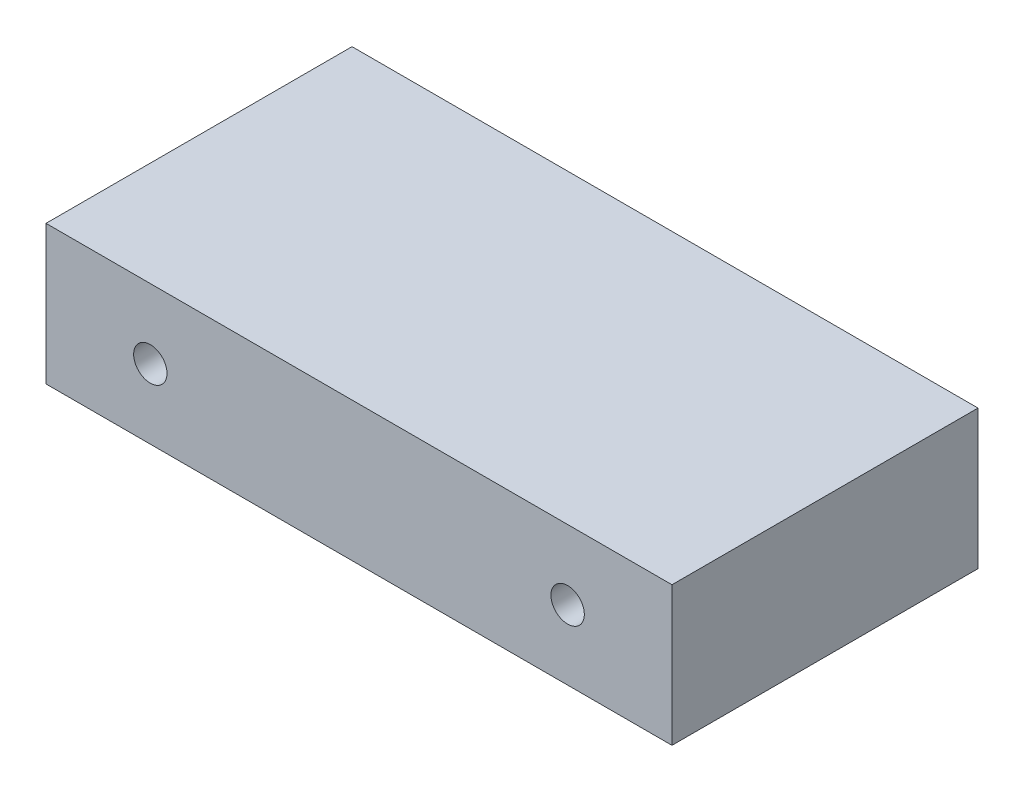
ISO-10303-21;
HEADER;
FILE_DESCRIPTION(('STEP AP214'),'2;1');
FILE_NAME('part.step','',(''),(''),'','','');
FILE_SCHEMA(('AUTOMOTIVE_DESIGN { 1 0 10303 214 1 1 1 1 }'));
ENDSEC;
DATA;
#1=APPLICATION_CONTEXT('core data for automotive mechanical design processes');
#2=APPLICATION_PROTOCOL_DEFINITION('international standard','automotive_design',2000,#1);
#3=PRODUCT_CONTEXT('',#1,'mechanical');
#4=PRODUCT('Part','Part','',(#3));
#5=PRODUCT_RELATED_PRODUCT_CATEGORY('part','',(#4));
#6=PRODUCT_DEFINITION_FORMATION('','',#4);
#7=PRODUCT_DEFINITION_CONTEXT('part definition',#1,'design');
#8=PRODUCT_DEFINITION('design','',#6,#7);
#9=PRODUCT_DEFINITION_SHAPE('','',#8);
#10=(LENGTH_UNIT() NAMED_UNIT(*) SI_UNIT(.MILLI.,.METRE.));
#11=(NAMED_UNIT(*) PLANE_ANGLE_UNIT() SI_UNIT($,.RADIAN.));
#12=(NAMED_UNIT(*) SI_UNIT($,.STERADIAN.) SOLID_ANGLE_UNIT());
#13=UNCERTAINTY_MEASURE_WITH_UNIT(LENGTH_MEASURE(1.E-05),#10,'distance_accuracy_value','');
#14=(GEOMETRIC_REPRESENTATION_CONTEXT(3) GLOBAL_UNCERTAINTY_ASSIGNED_CONTEXT((#13)) GLOBAL_UNIT_ASSIGNED_CONTEXT((#10,
#11,#12)) REPRESENTATION_CONTEXT('',''));
#15=CARTESIAN_POINT('',(0.,0.,0.));
#16=DIRECTION('',(0.,0.,1.));
#17=DIRECTION('',(1.,0.,0.));
#18=AXIS2_PLACEMENT_3D('',#15,#16,#17);
#19=CARTESIAN_POINT('',(-22.5,5.,22.));
#20=DIRECTION('',(1.,0.,0.));
#21=DIRECTION('',(0.,0.,-1.));
#22=AXIS2_PLACEMENT_3D('',#19,#20,#21);
#23=PLANE('',#22);
#24=DIRECTION('',(0.,0.,1.));
#25=VECTOR('',#24,1.);
#26=CARTESIAN_POINT('',(-22.5,-5.,22.));
#27=LINE('',#26,#25);
#28=CARTESIAN_POINT('',(-22.5,-5.,0.));
#29=VERTEX_POINT('',#28);
#30=CARTESIAN_POINT('',(-22.5,-5.,22.));
#31=VERTEX_POINT('',#30);
#32=EDGE_CURVE('E95',#29,#31,#27,.T.);
#33=ORIENTED_EDGE('',*,*,#32,.T.);
#34=DIRECTION('',(0.,-1.,0.));
#35=VECTOR('',#34,1.);
#36=CARTESIAN_POINT('',(-22.5,5.,22.));
#37=LINE('',#36,#35);
#38=CARTESIAN_POINT('',(-22.5,5.,22.));
#39=VERTEX_POINT('',#38);
#40=EDGE_CURVE('E11',#39,#31,#37,.T.);
#41=ORIENTED_EDGE('',*,*,#40,.F.);
#42=DIRECTION('',(0.,0.,1.));
#43=VECTOR('',#42,1.);
#44=CARTESIAN_POINT('',(-22.5,5.,22.));
#45=LINE('',#44,#43);
#46=CARTESIAN_POINT('',(-22.5,5.,0.));
#47=VERTEX_POINT('',#46);
#48=EDGE_CURVE('E83',#47,#39,#45,.T.);
#49=ORIENTED_EDGE('',*,*,#48,.F.);
#50=DIRECTION('',(0.,-1.,0.));
#51=VECTOR('',#50,1.);
#52=CARTESIAN_POINT('',(-22.5,5.,0.));
#53=LINE('',#52,#51);
#54=EDGE_CURVE('E91',#47,#29,#53,.T.);
#55=ORIENTED_EDGE('',*,*,#54,.T.);
#56=EDGE_LOOP('',(#33,#41,#49,#55));
#57=FACE_BOUND('',#56,.T.);
#58=ADVANCED_FACE('F32',(#57),#23,.F.);
#59=CARTESIAN_POINT('',(-22.5,5.,22.));
#60=DIRECTION('',(0.,0.,-1.));
#61=DIRECTION('',(-1.,0.,0.));
#62=AXIS2_PLACEMENT_3D('',#59,#60,#61);
#63=PLANE('',#62);
#64=CARTESIAN_POINT('',(15.,0.,22.));
#65=DIRECTION('',(0.,0.,1.));
#66=DIRECTION('',(1.,0.,0.));
#67=AXIS2_PLACEMENT_3D('',#64,#65,#66);
#68=CIRCLE('',#67,1.2);
#69=CARTESIAN_POINT('',(16.2,0.,22.));
#70=VERTEX_POINT('',#69);
#71=EDGE_CURVE('E115',#70,#70,#68,.T.);
#72=ORIENTED_EDGE('',*,*,#71,.F.);
#73=EDGE_LOOP('',(#72));
#74=FACE_BOUND('',#73,.T.);
#75=CARTESIAN_POINT('',(-15.,0.,22.));
#76=DIRECTION('',(0.,0.,1.));
#77=DIRECTION('',(1.,0.,0.));
#78=AXIS2_PLACEMENT_3D('',#75,#76,#77);
#79=CIRCLE('',#78,1.2);
#80=CARTESIAN_POINT('',(-13.8,0.,22.));
#81=VERTEX_POINT('',#80);
#82=EDGE_CURVE('E109',#81,#81,#79,.T.);
#83=ORIENTED_EDGE('',*,*,#82,.F.);
#84=EDGE_LOOP('',(#83));
#85=FACE_BOUND('',#84,.T.);
#86=DIRECTION('',(1.,0.,0.));
#87=VECTOR('',#86,1.);
#88=CARTESIAN_POINT('',(-22.5,-5.,22.));
#89=LINE('',#88,#87);
#90=CARTESIAN_POINT('',(22.5,-5.,22.));
#91=VERTEX_POINT('',#90);
#92=EDGE_CURVE('E87',#31,#91,#89,.T.);
#93=ORIENTED_EDGE('',*,*,#92,.T.);
#94=DIRECTION('',(0.,-1.,0.));
#95=VECTOR('',#94,1.);
#96=CARTESIAN_POINT('',(22.5,5.,22.));
#97=LINE('',#96,#95);
#98=CARTESIAN_POINT('',(22.5,5.,22.));
#99=VERTEX_POINT('',#98);
#100=EDGE_CURVE('E40',#99,#91,#97,.T.);
#101=ORIENTED_EDGE('',*,*,#100,.F.);
#102=DIRECTION('',(1.,0.,0.));
#103=VECTOR('',#102,1.);
#104=CARTESIAN_POINT('',(-22.5,5.,22.));
#105=LINE('',#104,#103);
#106=EDGE_CURVE('E78',#39,#99,#105,.T.);
#107=ORIENTED_EDGE('',*,*,#106,.F.);
#108=ORIENTED_EDGE('',*,*,#40,.T.);
#109=EDGE_LOOP('',(#93,#101,#107,#108));
#110=FACE_BOUND('',#109,.T.);
#111=ADVANCED_FACE('F86',(#74,#85,#110),#63,.F.);
#112=CARTESIAN_POINT('',(22.5,5.,22.));
#113=DIRECTION('',(-1.,0.,0.));
#114=DIRECTION('',(0.,0.,1.));
#115=AXIS2_PLACEMENT_3D('',#112,#113,#114);
#116=PLANE('',#115);
#117=DIRECTION('',(0.,0.,-1.));
#118=VECTOR('',#117,1.);
#119=CARTESIAN_POINT('',(22.5,-5.,22.));
#120=LINE('',#119,#118);
#121=CARTESIAN_POINT('',(22.5,-5.,0.));
#122=VERTEX_POINT('',#121);
#123=EDGE_CURVE('E65',#91,#122,#120,.T.);
#124=ORIENTED_EDGE('',*,*,#123,.T.);
#125=DIRECTION('',(0.,-1.,0.));
#126=VECTOR('',#125,1.);
#127=CARTESIAN_POINT('',(22.5,5.,0.));
#128=LINE('',#127,#126);
#129=CARTESIAN_POINT('',(22.5,5.,0.));
#130=VERTEX_POINT('',#129);
#131=EDGE_CURVE('E88',#130,#122,#128,.T.);
#132=ORIENTED_EDGE('',*,*,#131,.F.);
#133=DIRECTION('',(0.,0.,-1.));
#134=VECTOR('',#133,1.);
#135=CARTESIAN_POINT('',(22.5,5.,22.));
#136=LINE('',#135,#134);
#137=EDGE_CURVE('E81',#99,#130,#136,.T.);
#138=ORIENTED_EDGE('',*,*,#137,.F.);
#139=ORIENTED_EDGE('',*,*,#100,.T.);
#140=EDGE_LOOP('',(#124,#132,#138,#139));
#141=FACE_BOUND('',#140,.T.);
#142=ADVANCED_FACE('F89',(#141),#116,.F.);
#143=CARTESIAN_POINT('',(-22.5,5.,0.));
#144=DIRECTION('',(0.,0.,1.));
#145=DIRECTION('',(1.,0.,0.));
#146=AXIS2_PLACEMENT_3D('',#143,#144,#145);
#147=PLANE('',#146);
#148=CARTESIAN_POINT('',(15.,0.,0.));
#149=DIRECTION('',(0.,0.,1.));
#150=DIRECTION('',(1.,0.,0.));
#151=AXIS2_PLACEMENT_3D('',#148,#149,#150);
#152=CIRCLE('',#151,1.2);
#153=CARTESIAN_POINT('',(16.2,0.,0.));
#154=VERTEX_POINT('',#153);
#155=EDGE_CURVE('E112',#154,#154,#152,.T.);
#156=ORIENTED_EDGE('',*,*,#155,.T.);
#157=EDGE_LOOP('',(#156));
#158=FACE_BOUND('',#157,.T.);
#159=CARTESIAN_POINT('',(-15.,0.,0.));
#160=DIRECTION('',(0.,0.,1.));
#161=DIRECTION('',(1.,0.,0.));
#162=AXIS2_PLACEMENT_3D('',#159,#160,#161);
#163=CIRCLE('',#162,1.2);
#164=CARTESIAN_POINT('',(-13.8,0.,0.));
#165=VERTEX_POINT('',#164);
#166=EDGE_CURVE('E98',#165,#165,#163,.T.);
#167=ORIENTED_EDGE('',*,*,#166,.T.);
#168=EDGE_LOOP('',(#167));
#169=FACE_BOUND('',#168,.T.);
#170=DIRECTION('',(-1.,0.,0.));
#171=VECTOR('',#170,1.);
#172=CARTESIAN_POINT('',(-22.5,-5.,0.));
#173=LINE('',#172,#171);
#174=EDGE_CURVE('E71',#122,#29,#173,.T.);
#175=ORIENTED_EDGE('',*,*,#174,.T.);
#176=ORIENTED_EDGE('',*,*,#54,.F.);
#177=DIRECTION('',(-1.,0.,0.));
#178=VECTOR('',#177,1.);
#179=CARTESIAN_POINT('',(-22.5,5.,0.));
#180=LINE('',#179,#178);
#181=EDGE_CURVE('E48',#130,#47,#180,.T.);
#182=ORIENTED_EDGE('',*,*,#181,.F.);
#183=ORIENTED_EDGE('',*,*,#131,.T.);
#184=EDGE_LOOP('',(#175,#176,#182,#183));
#185=FACE_BOUND('',#184,.T.);
#186=ADVANCED_FACE('F103',(#158,#169,#185),#147,.F.);
#187=CARTESIAN_POINT('',(0.,5.,0.));
#188=DIRECTION('',(0.,-1.,0.));
#189=DIRECTION('',(0.,0.,-1.));
#190=AXIS2_PLACEMENT_3D('',#187,#188,#189);
#191=PLANE('',#190);
#192=ORIENTED_EDGE('',*,*,#48,.T.);
#193=ORIENTED_EDGE('',*,*,#106,.T.);
#194=ORIENTED_EDGE('',*,*,#137,.T.);
#195=ORIENTED_EDGE('',*,*,#181,.T.);
#196=EDGE_LOOP('',(#192,#193,#194,#195));
#197=FACE_BOUND('',#196,.T.);
#198=ADVANCED_FACE('F79',(#197),#191,.F.);
#199=CARTESIAN_POINT('',(0.,-5.,0.));
#200=DIRECTION('',(0.,-1.,0.));
#201=DIRECTION('',(0.,0.,-1.));
#202=AXIS2_PLACEMENT_3D('',#199,#200,#201);
#203=PLANE('',#202);
#204=ORIENTED_EDGE('',*,*,#32,.F.);
#205=ORIENTED_EDGE('',*,*,#174,.F.);
#206=ORIENTED_EDGE('',*,*,#123,.F.);
#207=ORIENTED_EDGE('',*,*,#92,.F.);
#208=EDGE_LOOP('',(#204,#205,#206,#207));
#209=FACE_BOUND('',#208,.T.);
#210=ADVANCED_FACE('F106',(#209),#203,.T.);
#211=CARTESIAN_POINT('',(-15.,0.,0.));
#212=DIRECTION('',(0.,0.,1.));
#213=DIRECTION('',(1.,0.,0.));
#214=AXIS2_PLACEMENT_3D('',#211,#212,#213);
#215=CYLINDRICAL_SURFACE('',#214,1.2);
#216=ORIENTED_EDGE('',*,*,#166,.F.);
#217=EDGE_LOOP('',(#216));
#218=FACE_BOUND('',#217,.T.);
#219=ORIENTED_EDGE('',*,*,#82,.T.);
#220=EDGE_LOOP('',(#219));
#221=FACE_BOUND('',#220,.T.);
#222=ADVANCED_FACE('F126',(#218,#221),#215,.F.);
#223=CARTESIAN_POINT('',(15.,0.,0.));
#224=DIRECTION('',(0.,0.,1.));
#225=DIRECTION('',(1.,0.,0.));
#226=AXIS2_PLACEMENT_3D('',#223,#224,#225);
#227=CYLINDRICAL_SURFACE('',#226,1.2);
#228=ORIENTED_EDGE('',*,*,#155,.F.);
#229=EDGE_LOOP('',(#228));
#230=FACE_BOUND('',#229,.T.);
#231=ORIENTED_EDGE('',*,*,#71,.T.);
#232=EDGE_LOOP('',(#231));
#233=FACE_BOUND('',#232,.T.);
#234=ADVANCED_FACE('F123',(#230,#233),#227,.F.);
#235=CLOSED_SHELL('',(#58,#111,#142,#186,#198,#210,#222,#234));
#236=MANIFOLD_SOLID_BREP('B2',#235);
#237=ADVANCED_BREP_SHAPE_REPRESENTATION('',(#18,#236),#14);
#238=SHAPE_DEFINITION_REPRESENTATION(#9,#237);
ENDSEC;
END-ISO-10303-21;
